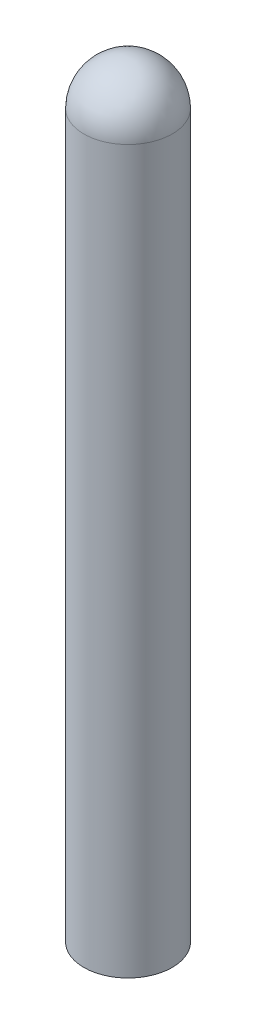
ISO-10303-21;
HEADER;
FILE_DESCRIPTION(('STEP AP214'),'2;1');
FILE_NAME('part.step','',(''),(''),'','','');
FILE_SCHEMA(('AUTOMOTIVE_DESIGN { 1 0 10303 214 1 1 1 1 }'));
ENDSEC;
DATA;
#1=APPLICATION_CONTEXT('core data for automotive mechanical design processes');
#2=APPLICATION_PROTOCOL_DEFINITION('international standard','automotive_design',2000,#1);
#3=PRODUCT_CONTEXT('',#1,'mechanical');
#4=PRODUCT('Part','Part','',(#3));
#5=PRODUCT_RELATED_PRODUCT_CATEGORY('part','',(#4));
#6=PRODUCT_DEFINITION_FORMATION('','',#4);
#7=PRODUCT_DEFINITION_CONTEXT('part definition',#1,'design');
#8=PRODUCT_DEFINITION('design','',#6,#7);
#9=PRODUCT_DEFINITION_SHAPE('','',#8);
#10=(LENGTH_UNIT() NAMED_UNIT(*) SI_UNIT(.MILLI.,.METRE.));
#11=(NAMED_UNIT(*) PLANE_ANGLE_UNIT() SI_UNIT($,.RADIAN.));
#12=(NAMED_UNIT(*) SI_UNIT($,.STERADIAN.) SOLID_ANGLE_UNIT());
#13=UNCERTAINTY_MEASURE_WITH_UNIT(LENGTH_MEASURE(1.E-05),#10,'distance_accuracy_value','');
#14=(GEOMETRIC_REPRESENTATION_CONTEXT(3) GLOBAL_UNCERTAINTY_ASSIGNED_CONTEXT((#13)) GLOBAL_UNIT_ASSIGNED_CONTEXT((#10,
#11,#12)) REPRESENTATION_CONTEXT('',''));
#15=CARTESIAN_POINT('',(0.,0.,0.));
#16=DIRECTION('',(0.,0.,1.));
#17=DIRECTION('',(1.,0.,0.));
#18=AXIS2_PLACEMENT_3D('',#15,#16,#17);
#19=CARTESIAN_POINT('',(0.,41.275,0.));
#20=DIRECTION('',(0.,-1.,0.));
#21=DIRECTION('',(0.,0.,-1.));
#22=AXIS2_PLACEMENT_3D('',#19,#20,#21);
#23=CYLINDRICAL_SURFACE('',#22,2.38125);
#24=CARTESIAN_POINT('',(0.,38.89375,0.));
#25=DIRECTION('',(0.,-1.,0.));
#26=DIRECTION('',(0.,0.,-1.));
#27=AXIS2_PLACEMENT_3D('',#24,#25,#26);
#28=CIRCLE('',#27,2.38125);
#29=CARTESIAN_POINT('',(0.,38.89375,-2.38125));
#30=VERTEX_POINT('',#29);
#31=EDGE_CURVE('E10',#30,#30,#28,.T.);
#32=ORIENTED_EDGE('',*,*,#31,.T.);
#33=EDGE_LOOP('',(#32));
#34=FACE_BOUND('',#33,.T.);
#35=CARTESIAN_POINT('',(0.,0.,0.));
#36=DIRECTION('',(0.,1.,0.));
#37=DIRECTION('',(0.,0.,1.));
#38=AXIS2_PLACEMENT_3D('',#35,#36,#37);
#39=CIRCLE('',#38,2.38125);
#40=CARTESIAN_POINT('',(0.,0.,2.38125));
#41=VERTEX_POINT('',#40);
#42=EDGE_CURVE('E37',#41,#41,#39,.T.);
#43=ORIENTED_EDGE('',*,*,#42,.T.);
#44=EDGE_LOOP('',(#43));
#45=FACE_BOUND('',#44,.T.);
#46=ADVANCED_FACE('F30',(#34,#45),#23,.T.);
#47=CARTESIAN_POINT('',(0.,0.,0.));
#48=DIRECTION('',(0.,1.,0.));
#49=DIRECTION('',(0.,0.,1.));
#50=AXIS2_PLACEMENT_3D('',#47,#48,#49);
#51=PLANE('',#50);
#52=ORIENTED_EDGE('',*,*,#42,.F.);
#53=EDGE_LOOP('',(#52));
#54=FACE_BOUND('',#53,.T.);
#55=ADVANCED_FACE('F44',(#54),#51,.F.);
#56=CARTESIAN_POINT('',(0.,38.89375,0.));
#57=DIRECTION('',(0.,0.,1.));
#58=DIRECTION('',(1.,0.,0.));
#59=AXIS2_PLACEMENT_3D('',#56,#57,#58);
#60=SPHERICAL_SURFACE('',#59,2.38125);
#61=CARTESIAN_POINT('',(0.,38.89375,0.));
#62=DIRECTION('',(0.,-1.,0.));
#63=DIRECTION('',(0.,0.,-1.));
#64=AXIS2_PLACEMENT_3D('',#61,#62,#63);
#65=SPHERICAL_SURFACE('',#64,2.38125);
#66=ORIENTED_EDGE('',*,*,#31,.F.);
#67=EDGE_LOOP('',(#66));
#68=FACE_BOUND('',#67,.T.);
#69=ADVANCED_FACE('F32',(#68),#65,.T.);
#70=CLOSED_SHELL('',(#46,#55,#69));
#71=MANIFOLD_SOLID_BREP('B2',#70);
#72=ADVANCED_BREP_SHAPE_REPRESENTATION('',(#18,#71),#14);
#73=SHAPE_DEFINITION_REPRESENTATION(#9,#72);
ENDSEC;
END-ISO-10303-21;
